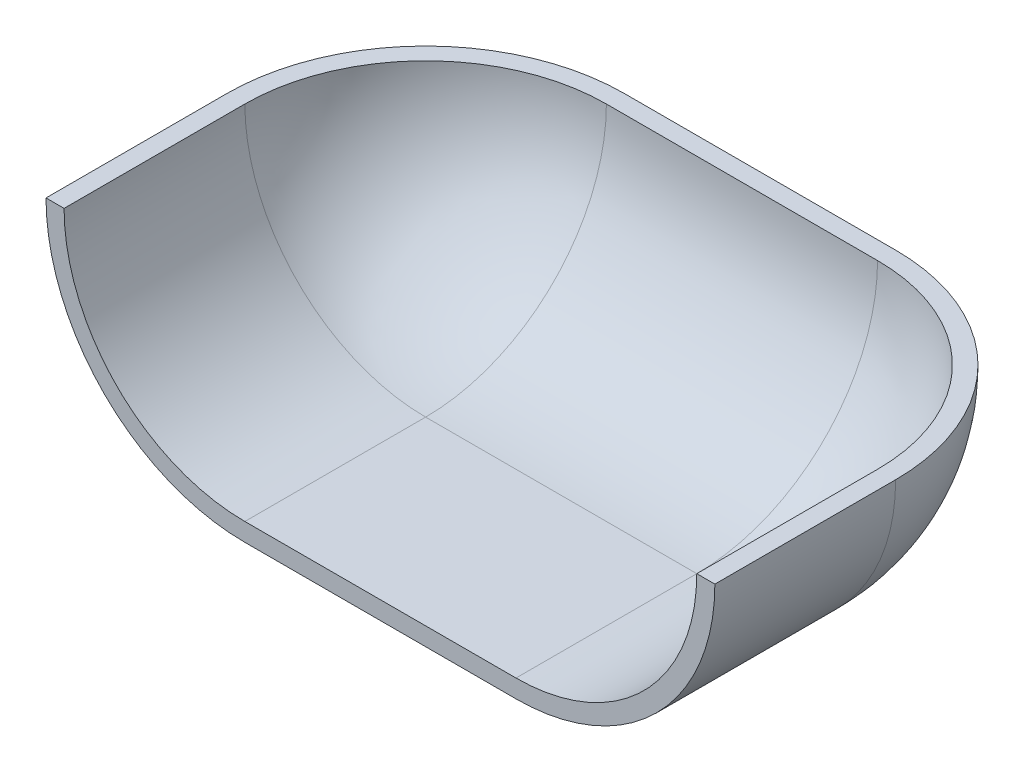
ISO-10303-21;
HEADER;
FILE_DESCRIPTION(('STEP AP214'),'2;1');
FILE_NAME('part.step','',(''),(''),'','','');
FILE_SCHEMA(('AUTOMOTIVE_DESIGN { 1 0 10303 214 1 1 1 1 }'));
ENDSEC;
DATA;
#1=APPLICATION_CONTEXT('core data for automotive mechanical design processes');
#2=APPLICATION_PROTOCOL_DEFINITION('international standard','automotive_design',2000,#1);
#3=PRODUCT_CONTEXT('',#1,'mechanical');
#4=PRODUCT('Part','Part','',(#3));
#5=PRODUCT_RELATED_PRODUCT_CATEGORY('part','',(#4));
#6=PRODUCT_DEFINITION_FORMATION('','',#4);
#7=PRODUCT_DEFINITION_CONTEXT('part definition',#1,'design');
#8=PRODUCT_DEFINITION('design','',#6,#7);
#9=PRODUCT_DEFINITION_SHAPE('','',#8);
#10=(LENGTH_UNIT() NAMED_UNIT(*) SI_UNIT(.MILLI.,.METRE.));
#11=(NAMED_UNIT(*) PLANE_ANGLE_UNIT() SI_UNIT($,.RADIAN.));
#12=(NAMED_UNIT(*) SI_UNIT($,.STERADIAN.) SOLID_ANGLE_UNIT());
#13=UNCERTAINTY_MEASURE_WITH_UNIT(LENGTH_MEASURE(1.E-05),#10,'distance_accuracy_value','');
#14=(GEOMETRIC_REPRESENTATION_CONTEXT(3) GLOBAL_UNCERTAINTY_ASSIGNED_CONTEXT((#13)) GLOBAL_UNIT_ASSIGNED_CONTEXT((#10,
#11,#12)) REPRESENTATION_CONTEXT('',''));
#15=CARTESIAN_POINT('',(0.,0.,0.));
#16=DIRECTION('',(0.,0.,1.));
#17=DIRECTION('',(1.,0.,0.));
#18=AXIS2_PLACEMENT_3D('',#15,#16,#17);
#19=CARTESIAN_POINT('',(19.05,12.7,0.));
#20=DIRECTION('',(-1.,0.,0.));
#21=DIRECTION('',(0.,0.,-1.));
#22=AXIS2_PLACEMENT_3D('',#19,#20,#21);
#23=SPHERICAL_SURFACE('',#22,13.97);
#24=CARTESIAN_POINT('',(19.05,12.7,0.));
#25=DIRECTION('',(0.,0.,1.));
#26=DIRECTION('',(1.,0.,0.));
#27=AXIS2_PLACEMENT_3D('',#24,#25,#26);
#28=CIRCLE('',#27,13.97);
#29=CARTESIAN_POINT('',(19.05,-1.27,0.));
#30=VERTEX_POINT('',#29);
#31=CARTESIAN_POINT('',(33.02,12.7,0.));
#32=VERTEX_POINT('',#31);
#33=EDGE_CURVE('E142',#30,#32,#28,.T.);
#34=ORIENTED_EDGE('',*,*,#33,.F.);
#35=CARTESIAN_POINT('',(19.05,12.7,0.));
#36=DIRECTION('',(-1.,0.,0.));
#37=DIRECTION('',(0.,0.,1.));
#38=AXIS2_PLACEMENT_3D('',#35,#36,#37);
#39=CIRCLE('',#38,13.97);
#40=CARTESIAN_POINT('',(19.05,12.7,-13.97));
#41=VERTEX_POINT('',#40);
#42=EDGE_CURVE('E56',#41,#30,#39,.T.);
#43=ORIENTED_EDGE('',*,*,#42,.F.);
#44=CARTESIAN_POINT('',(19.05,12.7,0.));
#45=DIRECTION('',(0.,-1.,0.));
#46=DIRECTION('',(1.,0.,0.));
#47=AXIS2_PLACEMENT_3D('',#44,#45,#46);
#48=CIRCLE('',#47,13.97);
#49=EDGE_CURVE('E209',#41,#32,#48,.T.);
#50=ORIENTED_EDGE('',*,*,#49,.T.);
#51=EDGE_LOOP('',(#34,#43,#50));
#52=FACE_BOUND('',#51,.T.);
#53=ADVANCED_FACE('F38',(#52),#23,.T.);
#54=CARTESIAN_POINT('',(19.05,12.7,0.));
#55=DIRECTION('',(-1.,0.,0.));
#56=DIRECTION('',(0.,0.,-1.));
#57=AXIS2_PLACEMENT_3D('',#54,#55,#56);
#58=SPHERICAL_SURFACE('',#57,12.7);
#59=CARTESIAN_POINT('',(19.05,12.7,0.));
#60=DIRECTION('',(-1.,0.,0.));
#61=DIRECTION('',(0.,0.,1.));
#62=AXIS2_PLACEMENT_3D('',#59,#60,#61);
#63=CIRCLE('',#62,12.7);
#64=CARTESIAN_POINT('',(19.05,12.7,-12.7));
#65=VERTEX_POINT('',#64);
#66=CARTESIAN_POINT('',(19.05,0.,0.));
#67=VERTEX_POINT('',#66);
#68=EDGE_CURVE('E11',#65,#67,#63,.T.);
#69=ORIENTED_EDGE('',*,*,#68,.T.);
#70=CARTESIAN_POINT('',(19.05,12.7,0.));
#71=DIRECTION('',(0.,0.,1.));
#72=DIRECTION('',(1.,0.,0.));
#73=AXIS2_PLACEMENT_3D('',#70,#71,#72);
#74=CIRCLE('',#73,12.7);
#75=CARTESIAN_POINT('',(31.75,12.7,0.));
#76=VERTEX_POINT('',#75);
#77=EDGE_CURVE('E192',#67,#76,#74,.T.);
#78=ORIENTED_EDGE('',*,*,#77,.T.);
#79=CARTESIAN_POINT('',(19.05,12.7,0.));
#80=DIRECTION('',(0.,-1.,0.));
#81=DIRECTION('',(1.,0.,0.));
#82=AXIS2_PLACEMENT_3D('',#79,#80,#81);
#83=CIRCLE('',#82,12.7);
#84=EDGE_CURVE('E212',#65,#76,#83,.T.);
#85=ORIENTED_EDGE('',*,*,#84,.F.);
#86=EDGE_LOOP('',(#69,#78,#85));
#87=FACE_BOUND('',#86,.T.);
#88=ADVANCED_FACE('F40',(#87),#58,.F.);
#89=CARTESIAN_POINT('',(-12.7,12.7,0.));
#90=DIRECTION('',(-1.,0.,0.));
#91=DIRECTION('',(0.,0.,1.));
#92=AXIS2_PLACEMENT_3D('',#89,#90,#91);
#93=CYLINDRICAL_SURFACE('',#92,12.7);
#94=CARTESIAN_POINT('',(0.,12.7,0.));
#95=DIRECTION('',(-1.,0.,0.));
#96=DIRECTION('',(0.,0.,1.));
#97=AXIS2_PLACEMENT_3D('',#94,#95,#96);
#98=CIRCLE('',#97,12.7);
#99=CARTESIAN_POINT('',(0.,12.7,-12.7));
#100=VERTEX_POINT('',#99);
#101=CARTESIAN_POINT('',(0.,0.,0.));
#102=VERTEX_POINT('',#101);
#103=EDGE_CURVE('E47',#100,#102,#98,.T.);
#104=ORIENTED_EDGE('',*,*,#103,.T.);
#105=DIRECTION('',(1.,0.,0.));
#106=VECTOR('',#105,1.);
#107=CARTESIAN_POINT('',(0.,0.,0.));
#108=LINE('',#107,#106);
#109=EDGE_CURVE('E195',#102,#67,#108,.T.);
#110=ORIENTED_EDGE('',*,*,#109,.T.);
#111=ORIENTED_EDGE('',*,*,#68,.F.);
#112=DIRECTION('',(1.,0.,0.));
#113=VECTOR('',#112,1.);
#114=CARTESIAN_POINT('',(0.,12.7,-12.7));
#115=LINE('',#114,#113);
#116=EDGE_CURVE('E215',#100,#65,#115,.T.);
#117=ORIENTED_EDGE('',*,*,#116,.F.);
#118=EDGE_LOOP('',(#104,#110,#111,#117));
#119=FACE_BOUND('',#118,.T.);
#120=ADVANCED_FACE('F234',(#119),#93,.F.);
#121=CARTESIAN_POINT('',(0.,12.7,0.));
#122=DIRECTION('',(-1.,0.,0.));
#123=DIRECTION('',(0.,0.,1.));
#124=AXIS2_PLACEMENT_3D('',#121,#122,#123);
#125=SPHERICAL_SURFACE('',#124,12.7);
#126=CARTESIAN_POINT('',(0.,12.7,0.));
#127=DIRECTION('',(0.,0.,1.));
#128=DIRECTION('',(-1.,0.,0.));
#129=AXIS2_PLACEMENT_3D('',#126,#127,#128);
#130=CIRCLE('',#129,12.7);
#131=CARTESIAN_POINT('',(-12.7,12.7,0.));
#132=VERTEX_POINT('',#131);
#133=EDGE_CURVE('E199',#132,#102,#130,.T.);
#134=ORIENTED_EDGE('',*,*,#133,.T.);
#135=ORIENTED_EDGE('',*,*,#103,.F.);
#136=CARTESIAN_POINT('',(0.,12.7,0.));
#137=DIRECTION('',(0.,-1.,0.));
#138=DIRECTION('',(-1.,0.,0.));
#139=AXIS2_PLACEMENT_3D('',#136,#137,#138);
#140=CIRCLE('',#139,12.7);
#141=EDGE_CURVE('E219',#132,#100,#140,.T.);
#142=ORIENTED_EDGE('',*,*,#141,.F.);
#143=EDGE_LOOP('',(#134,#135,#142));
#144=FACE_BOUND('',#143,.T.);
#145=ADVANCED_FACE('F238',(#144),#125,.F.);
#146=CARTESIAN_POINT('',(0.,12.7,0.));
#147=DIRECTION('',(-1.,0.,0.));
#148=DIRECTION('',(0.,0.,1.));
#149=AXIS2_PLACEMENT_3D('',#146,#147,#148);
#150=SPHERICAL_SURFACE('',#149,13.97);
#151=CARTESIAN_POINT('',(0.,12.7,0.));
#152=DIRECTION('',(-1.,0.,0.));
#153=DIRECTION('',(0.,0.,1.));
#154=AXIS2_PLACEMENT_3D('',#151,#152,#153);
#155=CIRCLE('',#154,13.97);
#156=CARTESIAN_POINT('',(0.,12.7,-13.97));
#157=VERTEX_POINT('',#156);
#158=CARTESIAN_POINT('',(0.,-1.27,0.));
#159=VERTEX_POINT('',#158);
#160=EDGE_CURVE('E64',#157,#159,#155,.T.);
#161=ORIENTED_EDGE('',*,*,#160,.T.);
#162=CARTESIAN_POINT('',(0.,12.7,0.));
#163=DIRECTION('',(0.,0.,1.));
#164=DIRECTION('',(1.,0.,0.));
#165=AXIS2_PLACEMENT_3D('',#162,#163,#164);
#166=CIRCLE('',#165,13.97);
#167=CARTESIAN_POINT('',(-13.97,12.7,0.));
#168=VERTEX_POINT('',#167);
#169=EDGE_CURVE('E202',#168,#159,#166,.T.);
#170=ORIENTED_EDGE('',*,*,#169,.F.);
#171=CARTESIAN_POINT('',(0.,12.7,0.));
#172=DIRECTION('',(0.,-1.,0.));
#173=DIRECTION('',(1.,0.,0.));
#174=AXIS2_PLACEMENT_3D('',#171,#172,#173);
#175=CIRCLE('',#174,13.97);
#176=EDGE_CURVE('E223',#168,#157,#175,.T.);
#177=ORIENTED_EDGE('',*,*,#176,.T.);
#178=EDGE_LOOP('',(#161,#170,#177));
#179=FACE_BOUND('',#178,.T.);
#180=ADVANCED_FACE('F270',(#179),#150,.T.);
#181=CARTESIAN_POINT('',(-12.7,12.7,0.));
#182=DIRECTION('',(-1.,0.,0.));
#183=DIRECTION('',(0.,0.,1.));
#184=AXIS2_PLACEMENT_3D('',#181,#182,#183);
#185=CYLINDRICAL_SURFACE('',#184,13.97);
#186=DIRECTION('',(1.,0.,0.));
#187=VECTOR('',#186,1.);
#188=CARTESIAN_POINT('',(0.,12.7,-13.97));
#189=LINE('',#188,#187);
#190=EDGE_CURVE('E226',#157,#41,#189,.T.);
#191=ORIENTED_EDGE('',*,*,#190,.T.);
#192=ORIENTED_EDGE('',*,*,#42,.T.);
#193=DIRECTION('',(1.,0.,0.));
#194=VECTOR('',#193,1.);
#195=CARTESIAN_POINT('',(0.,-1.27,0.));
#196=LINE('',#195,#194);
#197=EDGE_CURVE('E205',#159,#30,#196,.T.);
#198=ORIENTED_EDGE('',*,*,#197,.F.);
#199=ORIENTED_EDGE('',*,*,#160,.F.);
#200=EDGE_LOOP('',(#191,#192,#198,#199));
#201=FACE_BOUND('',#200,.T.);
#202=ADVANCED_FACE('F257',(#201),#185,.T.);
#203=CARTESIAN_POINT('',(19.05,12.7,0.));
#204=DIRECTION('',(0.,-1.,0.));
#205=DIRECTION('',(1.,0.,0.));
#206=AXIS2_PLACEMENT_3D('',#203,#204,#205);
#207=PLANE('',#206);
#208=ORIENTED_EDGE('',*,*,#49,.F.);
#209=ORIENTED_EDGE('',*,*,#190,.F.);
#210=ORIENTED_EDGE('',*,*,#176,.F.);
#211=DIRECTION('',(0.,0.,-1.));
#212=VECTOR('',#211,1.);
#213=CARTESIAN_POINT('',(-13.97,12.7,12.7));
#214=LINE('',#213,#212);
#215=CARTESIAN_POINT('',(-13.97,12.7,12.7));
#216=VERTEX_POINT('',#215);
#217=EDGE_CURVE('E175',#216,#168,#214,.T.);
#218=ORIENTED_EDGE('',*,*,#217,.F.);
#219=DIRECTION('',(1.,0.,0.));
#220=VECTOR('',#219,1.);
#221=CARTESIAN_POINT('',(-13.97,12.7,12.7));
#222=LINE('',#221,#220);
#223=CARTESIAN_POINT('',(-12.7,12.7,12.7));
#224=VERTEX_POINT('',#223);
#225=EDGE_CURVE('E162',#216,#224,#222,.T.);
#226=ORIENTED_EDGE('',*,*,#225,.T.);
#227=DIRECTION('',(0.,0.,-1.));
#228=VECTOR('',#227,1.);
#229=CARTESIAN_POINT('',(-12.7,12.7,12.7));
#230=LINE('',#229,#228);
#231=EDGE_CURVE('E178',#224,#132,#230,.T.);
#232=ORIENTED_EDGE('',*,*,#231,.T.);
#233=ORIENTED_EDGE('',*,*,#141,.T.);
#234=ORIENTED_EDGE('',*,*,#116,.T.);
#235=ORIENTED_EDGE('',*,*,#84,.T.);
#236=DIRECTION('',(0.,0.,-1.));
#237=VECTOR('',#236,1.);
#238=CARTESIAN_POINT('',(31.75,12.7,12.7));
#239=LINE('',#238,#237);
#240=CARTESIAN_POINT('',(31.75,12.7,12.7));
#241=VERTEX_POINT('',#240);
#242=EDGE_CURVE('E145',#241,#76,#239,.T.);
#243=ORIENTED_EDGE('',*,*,#242,.F.);
#244=DIRECTION('',(1.,0.,0.));
#245=VECTOR('',#244,1.);
#246=CARTESIAN_POINT('',(31.75,12.7,12.7));
#247=LINE('',#246,#245);
#248=CARTESIAN_POINT('',(33.02,12.7,12.7));
#249=VERTEX_POINT('',#248);
#250=EDGE_CURVE('E129',#241,#249,#247,.T.);
#251=ORIENTED_EDGE('',*,*,#250,.T.);
#252=DIRECTION('',(0.,0.,-1.));
#253=VECTOR('',#252,1.);
#254=CARTESIAN_POINT('',(33.02,12.7,12.7));
#255=LINE('',#254,#253);
#256=EDGE_CURVE('E140',#249,#32,#255,.T.);
#257=ORIENTED_EDGE('',*,*,#256,.T.);
#258=EDGE_LOOP('',(#208,#209,#210,#218,#226,#232,#233,#234,#235,#243,#251,#257));
#259=FACE_BOUND('',#258,.T.);
#260=ADVANCED_FACE('F147',(#259),#207,.F.);
#261=CARTESIAN_POINT('',(19.05,12.7,12.7));
#262=DIRECTION('',(0.,0.,-1.));
#263=DIRECTION('',(-1.,0.,0.));
#264=AXIS2_PLACEMENT_3D('',#261,#262,#263);
#265=CYLINDRICAL_SURFACE('',#264,13.97);
#266=ORIENTED_EDGE('',*,*,#33,.T.);
#267=ORIENTED_EDGE('',*,*,#256,.F.);
#268=CARTESIAN_POINT('',(19.05,12.7,12.7));
#269=DIRECTION('',(0.,0.,1.));
#270=DIRECTION('',(1.,0.,0.));
#271=AXIS2_PLACEMENT_3D('',#268,#269,#270);
#272=CIRCLE('',#271,13.97);
#273=CARTESIAN_POINT('',(19.05,-1.27,12.7));
#274=VERTEX_POINT('',#273);
#275=EDGE_CURVE('E124',#274,#249,#272,.T.);
#276=ORIENTED_EDGE('',*,*,#275,.F.);
#277=DIRECTION('',(0.,0.,-1.));
#278=VECTOR('',#277,1.);
#279=CARTESIAN_POINT('',(19.05,-1.27,12.7));
#280=LINE('',#279,#278);
#281=EDGE_CURVE('E169',#274,#30,#280,.T.);
#282=ORIENTED_EDGE('',*,*,#281,.T.);
#283=EDGE_LOOP('',(#266,#267,#276,#282));
#284=FACE_BOUND('',#283,.T.);
#285=ADVANCED_FACE('F141',(#284),#265,.T.);
#286=CARTESIAN_POINT('',(19.05,12.7,12.7));
#287=DIRECTION('',(0.,0.,-1.));
#288=DIRECTION('',(-1.,0.,0.));
#289=AXIS2_PLACEMENT_3D('',#286,#287,#288);
#290=CYLINDRICAL_SURFACE('',#289,12.7);
#291=ORIENTED_EDGE('',*,*,#77,.F.);
#292=DIRECTION('',(0.,0.,-1.));
#293=VECTOR('',#292,1.);
#294=CARTESIAN_POINT('',(19.05,0.,12.7));
#295=LINE('',#294,#293);
#296=CARTESIAN_POINT('',(19.05,0.,12.7));
#297=VERTEX_POINT('',#296);
#298=EDGE_CURVE('E184',#297,#67,#295,.T.);
#299=ORIENTED_EDGE('',*,*,#298,.F.);
#300=CARTESIAN_POINT('',(19.05,12.7,12.7));
#301=DIRECTION('',(0.,0.,1.));
#302=DIRECTION('',(1.,0.,0.));
#303=AXIS2_PLACEMENT_3D('',#300,#301,#302);
#304=CIRCLE('',#303,12.7);
#305=EDGE_CURVE('E150',#297,#241,#304,.T.);
#306=ORIENTED_EDGE('',*,*,#305,.T.);
#307=ORIENTED_EDGE('',*,*,#242,.T.);
#308=EDGE_LOOP('',(#291,#299,#306,#307));
#309=FACE_BOUND('',#308,.T.);
#310=ADVANCED_FACE('F247',(#309),#290,.F.);
#311=CARTESIAN_POINT('',(0.,0.,12.7));
#312=DIRECTION('',(0.,1.,0.));
#313=DIRECTION('',(-1.,0.,0.));
#314=AXIS2_PLACEMENT_3D('',#311,#312,#313);
#315=PLANE('',#314);
#316=ORIENTED_EDGE('',*,*,#109,.F.);
#317=DIRECTION('',(0.,0.,-1.));
#318=VECTOR('',#317,1.);
#319=CARTESIAN_POINT('',(0.,0.,12.7));
#320=LINE('',#319,#318);
#321=CARTESIAN_POINT('',(0.,0.,12.7));
#322=VERTEX_POINT('',#321);
#323=EDGE_CURVE('E181',#322,#102,#320,.T.);
#324=ORIENTED_EDGE('',*,*,#323,.F.);
#325=DIRECTION('',(1.,0.,0.));
#326=VECTOR('',#325,1.);
#327=CARTESIAN_POINT('',(0.,0.,12.7));
#328=LINE('',#327,#326);
#329=EDGE_CURVE('E153',#322,#297,#328,.T.);
#330=ORIENTED_EDGE('',*,*,#329,.T.);
#331=ORIENTED_EDGE('',*,*,#298,.T.);
#332=EDGE_LOOP('',(#316,#324,#330,#331));
#333=FACE_BOUND('',#332,.T.);
#334=ADVANCED_FACE('F244',(#333),#315,.T.);
#335=CARTESIAN_POINT('',(0.,12.7,12.7));
#336=DIRECTION('',(0.,0.,-1.));
#337=DIRECTION('',(-1.,0.,0.));
#338=AXIS2_PLACEMENT_3D('',#335,#336,#337);
#339=CYLINDRICAL_SURFACE('',#338,12.7);
#340=ORIENTED_EDGE('',*,*,#133,.F.);
#341=ORIENTED_EDGE('',*,*,#231,.F.);
#342=CARTESIAN_POINT('',(0.,12.7,12.7));
#343=DIRECTION('',(0.,0.,1.));
#344=DIRECTION('',(-1.,0.,0.));
#345=AXIS2_PLACEMENT_3D('',#342,#343,#344);
#346=CIRCLE('',#345,12.7);
#347=EDGE_CURVE('E159',#224,#322,#346,.T.);
#348=ORIENTED_EDGE('',*,*,#347,.T.);
#349=ORIENTED_EDGE('',*,*,#323,.T.);
#350=EDGE_LOOP('',(#340,#341,#348,#349));
#351=FACE_BOUND('',#350,.T.);
#352=ADVANCED_FACE('F240',(#351),#339,.F.);
#353=CARTESIAN_POINT('',(0.,12.7,12.7));
#354=DIRECTION('',(0.,0.,-1.));
#355=DIRECTION('',(-1.,0.,0.));
#356=AXIS2_PLACEMENT_3D('',#353,#354,#355);
#357=CYLINDRICAL_SURFACE('',#356,13.97);
#358=ORIENTED_EDGE('',*,*,#169,.T.);
#359=DIRECTION('',(0.,0.,-1.));
#360=VECTOR('',#359,1.);
#361=CARTESIAN_POINT('',(0.,-1.27,12.7));
#362=LINE('',#361,#360);
#363=CARTESIAN_POINT('',(0.,-1.27,12.7));
#364=VERTEX_POINT('',#363);
#365=EDGE_CURVE('E172',#364,#159,#362,.T.);
#366=ORIENTED_EDGE('',*,*,#365,.F.);
#367=CARTESIAN_POINT('',(0.,12.7,12.7));
#368=DIRECTION('',(0.,0.,1.));
#369=DIRECTION('',(1.,0.,0.));
#370=AXIS2_PLACEMENT_3D('',#367,#368,#369);
#371=CIRCLE('',#370,13.97);
#372=EDGE_CURVE('E165',#216,#364,#371,.T.);
#373=ORIENTED_EDGE('',*,*,#372,.F.);
#374=ORIENTED_EDGE('',*,*,#217,.T.);
#375=EDGE_LOOP('',(#358,#366,#373,#374));
#376=FACE_BOUND('',#375,.T.);
#377=ADVANCED_FACE('F254',(#376),#357,.T.);
#378=CARTESIAN_POINT('',(0.,-1.27,12.7));
#379=DIRECTION('',(0.,1.,0.));
#380=DIRECTION('',(-1.,0.,0.));
#381=AXIS2_PLACEMENT_3D('',#378,#379,#380);
#382=PLANE('',#381);
#383=ORIENTED_EDGE('',*,*,#197,.T.);
#384=ORIENTED_EDGE('',*,*,#281,.F.);
#385=DIRECTION('',(1.,0.,0.));
#386=VECTOR('',#385,1.);
#387=CARTESIAN_POINT('',(0.,-1.27,12.7));
#388=LINE('',#387,#386);
#389=EDGE_CURVE('E132',#364,#274,#388,.T.);
#390=ORIENTED_EDGE('',*,*,#389,.F.);
#391=ORIENTED_EDGE('',*,*,#365,.T.);
#392=EDGE_LOOP('',(#383,#384,#390,#391));
#393=FACE_BOUND('',#392,.T.);
#394=ADVANCED_FACE('F256',(#393),#382,.F.);
#395=CARTESIAN_POINT('',(19.05,12.7,12.7));
#396=DIRECTION('',(0.,0.,1.));
#397=DIRECTION('',(1.,0.,0.));
#398=AXIS2_PLACEMENT_3D('',#395,#396,#397);
#399=PLANE('',#398);
#400=ORIENTED_EDGE('',*,*,#275,.T.);
#401=ORIENTED_EDGE('',*,*,#250,.F.);
#402=ORIENTED_EDGE('',*,*,#305,.F.);
#403=ORIENTED_EDGE('',*,*,#329,.F.);
#404=ORIENTED_EDGE('',*,*,#347,.F.);
#405=ORIENTED_EDGE('',*,*,#225,.F.);
#406=ORIENTED_EDGE('',*,*,#372,.T.);
#407=ORIENTED_EDGE('',*,*,#389,.T.);
#408=EDGE_LOOP('',(#400,#401,#402,#403,#404,#405,#406,#407));
#409=FACE_BOUND('',#408,.T.);
#410=ADVANCED_FACE('F126',(#409),#399,.T.);
#411=CLOSED_SHELL('',(#53,#88,#120,#145,#180,#202,#260,#285,#310,#334,#352,#377,#394,#410));
#412=MANIFOLD_SOLID_BREP('B2',#411);
#413=ADVANCED_BREP_SHAPE_REPRESENTATION('',(#18,#412),#14);
#414=SHAPE_DEFINITION_REPRESENTATION(#9,#413);
ENDSEC;
END-ISO-10303-21;
